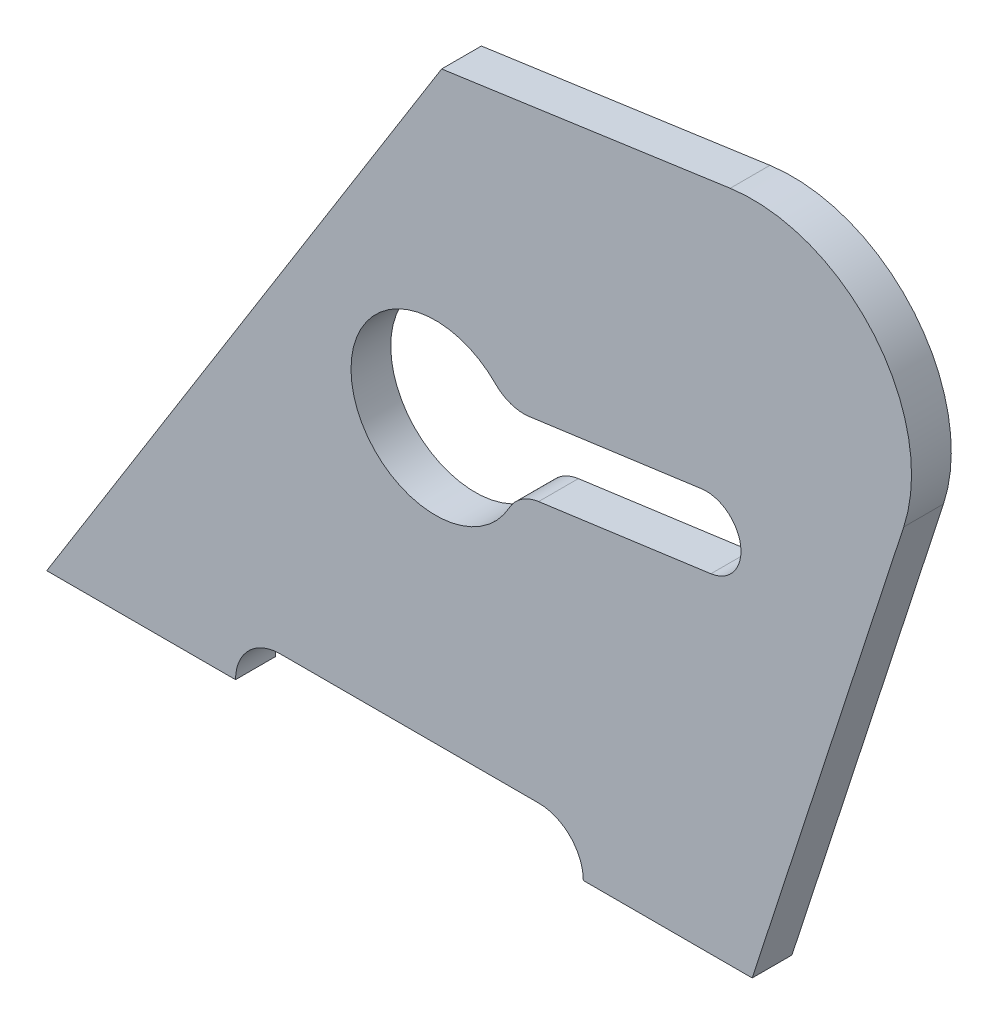
ISO-10303-21;
HEADER;
FILE_DESCRIPTION(('STEP AP214'),'2;1');
FILE_NAME('part.step','',(''),(''),'','','');
FILE_SCHEMA(('AUTOMOTIVE_DESIGN { 1 0 10303 214 1 1 1 1 }'));
ENDSEC;
DATA;
#1=APPLICATION_CONTEXT('core data for automotive mechanical design processes');
#2=APPLICATION_PROTOCOL_DEFINITION('international standard','automotive_design',2000,#1);
#3=PRODUCT_CONTEXT('',#1,'mechanical');
#4=PRODUCT('Part','Part','',(#3));
#5=PRODUCT_RELATED_PRODUCT_CATEGORY('part','',(#4));
#6=PRODUCT_DEFINITION_FORMATION('','',#4);
#7=PRODUCT_DEFINITION_CONTEXT('part definition',#1,'design');
#8=PRODUCT_DEFINITION('design','',#6,#7);
#9=PRODUCT_DEFINITION_SHAPE('','',#8);
#10=(LENGTH_UNIT() NAMED_UNIT(*) SI_UNIT(.MILLI.,.METRE.));
#11=(NAMED_UNIT(*) PLANE_ANGLE_UNIT() SI_UNIT($,.RADIAN.));
#12=(NAMED_UNIT(*) SI_UNIT($,.STERADIAN.) SOLID_ANGLE_UNIT());
#13=UNCERTAINTY_MEASURE_WITH_UNIT(LENGTH_MEASURE(1.E-05),#10,'distance_accuracy_value','');
#14=(GEOMETRIC_REPRESENTATION_CONTEXT(3) GLOBAL_UNCERTAINTY_ASSIGNED_CONTEXT((#13)) GLOBAL_UNIT_ASSIGNED_CONTEXT((#10,
#11,#12)) REPRESENTATION_CONTEXT('',''));
#15=CARTESIAN_POINT('',(0.,0.,0.));
#16=DIRECTION('',(0.,0.,1.));
#17=DIRECTION('',(1.,0.,0.));
#18=AXIS2_PLACEMENT_3D('',#15,#16,#17);
#19=CARTESIAN_POINT('',(128.440206600622,-41.7327529127653,8.));
#20=DIRECTION('',(-0.951056516295154,0.309016994374945,0.));
#21=DIRECTION('',(-0.309016994374945,-0.951056516295155,0.));
#22=AXIS2_PLACEMENT_3D('',#19,#20,#21);
#23=PLANE('',#22);
#24=DIRECTION('',(0.309016994374945,0.951056516295155,0.));
#25=VECTOR('',#24,1.);
#26=CARTESIAN_POINT('',(128.440206600622,-41.7327529127653,0.));
#27=LINE('',#26,#25);
#28=CARTESIAN_POINT('',(142.,0.,0.));
#29=VERTEX_POINT('',#28);
#30=CARTESIAN_POINT('',(172.503548140475,93.8802679373735,0.));
#31=VERTEX_POINT('',#30);
#32=EDGE_CURVE('E216',#29,#31,#27,.T.);
#33=ORIENTED_EDGE('',*,*,#32,.T.);
#34=DIRECTION('',(0.,0.,-1.));
#35=VECTOR('',#34,1.);
#36=CARTESIAN_POINT('',(172.503548140475,93.8802679373735,8.));
#37=LINE('',#36,#35);
#38=CARTESIAN_POINT('',(172.503548140475,93.8802679373735,8.));
#39=VERTEX_POINT('',#38);
#40=EDGE_CURVE('E11',#39,#31,#37,.T.);
#41=ORIENTED_EDGE('',*,*,#40,.F.);
#42=DIRECTION('',(0.309016994374945,0.951056516295155,0.));
#43=VECTOR('',#42,1.);
#44=CARTESIAN_POINT('',(128.440206600622,-41.7327529127653,8.));
#45=LINE('',#44,#43);
#46=CARTESIAN_POINT('',(142.,0.,8.));
#47=VERTEX_POINT('',#46);
#48=EDGE_CURVE('E317',#47,#39,#45,.T.);
#49=ORIENTED_EDGE('',*,*,#48,.F.);
#50=DIRECTION('',(0.,0.,-1.));
#51=VECTOR('',#50,1.);
#52=CARTESIAN_POINT('',(142.,0.,8.));
#53=LINE('',#52,#51);
#54=EDGE_CURVE('E242',#47,#29,#53,.T.);
#55=ORIENTED_EDGE('',*,*,#54,.T.);
#56=EDGE_LOOP('',(#33,#41,#49,#55));
#57=FACE_BOUND('',#56,.T.);
#58=ADVANCED_FACE('F45',(#57),#23,.F.);
#59=CARTESIAN_POINT('',(142.06973961903,103.768811757372,8.));
#60=DIRECTION('',(0.,0.,-1.));
#61=DIRECTION('',(-1.,0.,0.));
#62=AXIS2_PLACEMENT_3D('',#59,#60,#61);
#63=CYLINDRICAL_SURFACE('',#62,32.0000000000001);
#64=CARTESIAN_POINT('',(142.06973961903,103.768811757372,0.));
#65=DIRECTION('',(0.,0.,1.));
#66=DIRECTION('',(1.,0.,0.));
#67=AXIS2_PLACEMENT_3D('',#64,#65,#66);
#68=CIRCLE('',#67,32.0000000000001);
#69=CARTESIAN_POINT('',(137.573015723534,135.451290735629,0.));
#70=VERTEX_POINT('',#69);
#71=EDGE_CURVE('E220',#31,#70,#68,.T.);
#72=ORIENTED_EDGE('',*,*,#71,.T.);
#73=DIRECTION('',(0.,0.,-1.));
#74=VECTOR('',#73,1.);
#75=CARTESIAN_POINT('',(137.573015723534,135.451290735629,8.));
#76=LINE('',#75,#74);
#77=CARTESIAN_POINT('',(137.573015723534,135.451290735629,8.));
#78=VERTEX_POINT('',#77);
#79=EDGE_CURVE('E56',#78,#70,#76,.T.);
#80=ORIENTED_EDGE('',*,*,#79,.F.);
#81=CARTESIAN_POINT('',(142.06973961903,103.768811757372,8.));
#82=DIRECTION('',(0.,0.,1.));
#83=DIRECTION('',(1.,0.,0.));
#84=AXIS2_PLACEMENT_3D('',#81,#82,#83);
#85=CIRCLE('',#84,32.0000000000001);
#86=EDGE_CURVE('E320',#39,#78,#85,.T.);
#87=ORIENTED_EDGE('',*,*,#86,.F.);
#88=ORIENTED_EDGE('',*,*,#40,.T.);
#89=EDGE_LOOP('',(#72,#80,#87,#88));
#90=FACE_BOUND('',#89,.T.);
#91=ADVANCED_FACE('F362',(#90),#63,.T.);
#92=CARTESIAN_POINT('',(-16.1285050060782,113.636290037189,8.));
#93=DIRECTION('',(0.14052262173426,-0.990077468070519,0.));
#94=DIRECTION('',(0.990077468070519,0.14052262173426,0.));
#95=AXIS2_PLACEMENT_3D('',#92,#93,#94);
#96=PLANE('',#95);
#97=DIRECTION('',(-0.990077468070519,-0.14052262173426,0.));
#98=VECTOR('',#97,1.);
#99=CARTESIAN_POINT('',(-16.1285050060782,113.636290037189,0.));
#100=LINE('',#99,#98);
#101=CARTESIAN_POINT('',(79.4878896349813,127.207214423464,0.));
#102=VERTEX_POINT('',#101);
#103=EDGE_CURVE('E223',#70,#102,#100,.T.);
#104=ORIENTED_EDGE('',*,*,#103,.T.);
#105=DIRECTION('',(0.,0.,-1.));
#106=VECTOR('',#105,1.);
#107=CARTESIAN_POINT('',(79.4878896349813,127.207214423464,8.));
#108=LINE('',#107,#106);
#109=CARTESIAN_POINT('',(79.4878896349813,127.207214423464,8.));
#110=VERTEX_POINT('',#109);
#111=EDGE_CURVE('E257',#110,#102,#108,.T.);
#112=ORIENTED_EDGE('',*,*,#111,.F.);
#113=DIRECTION('',(-0.990077468070519,-0.14052262173426,0.));
#114=VECTOR('',#113,1.);
#115=CARTESIAN_POINT('',(-16.1285050060782,113.636290037189,8.));
#116=LINE('',#115,#114);
#117=EDGE_CURVE('E323',#78,#110,#116,.T.);
#118=ORIENTED_EDGE('',*,*,#117,.F.);
#119=ORIENTED_EDGE('',*,*,#79,.T.);
#120=EDGE_LOOP('',(#104,#112,#118,#119));
#121=FACE_BOUND('',#120,.T.);
#122=ADVANCED_FACE('F367',(#121),#96,.F.);
#123=CARTESIAN_POINT('',(0.,0.,8.));
#124=DIRECTION('',(0.848048096156423,-0.529919264233209,0.));
#125=DIRECTION('',(0.529919264233209,0.848048096156423,0.));
#126=AXIS2_PLACEMENT_3D('',#123,#124,#125);
#127=PLANE('',#126);
#128=DIRECTION('',(-0.529919264233209,-0.848048096156423,0.));
#129=VECTOR('',#128,1.);
#130=CARTESIAN_POINT('',(0.,0.,0.));
#131=LINE('',#130,#129);
#132=CARTESIAN_POINT('',(0.,0.,0.));
#133=VERTEX_POINT('',#132);
#134=EDGE_CURVE('E226',#102,#133,#131,.T.);
#135=ORIENTED_EDGE('',*,*,#134,.T.);
#136=DIRECTION('',(0.,0.,-1.));
#137=VECTOR('',#136,1.);
#138=CARTESIAN_POINT('',(0.,0.,8.));
#139=LINE('',#138,#137);
#140=CARTESIAN_POINT('',(0.,0.,8.));
#141=VERTEX_POINT('',#140);
#142=EDGE_CURVE('E253',#141,#133,#139,.T.);
#143=ORIENTED_EDGE('',*,*,#142,.F.);
#144=DIRECTION('',(-0.529919264233209,-0.848048096156423,0.));
#145=VECTOR('',#144,1.);
#146=CARTESIAN_POINT('',(0.,0.,8.));
#147=LINE('',#146,#145);
#148=EDGE_CURVE('E326',#110,#141,#147,.T.);
#149=ORIENTED_EDGE('',*,*,#148,.F.);
#150=ORIENTED_EDGE('',*,*,#111,.T.);
#151=EDGE_LOOP('',(#135,#143,#149,#150));
#152=FACE_BOUND('',#151,.T.);
#153=ADVANCED_FACE('F394',(#152),#127,.F.);
#154=CARTESIAN_POINT('',(0.,0.,8.));
#155=DIRECTION('',(0.,1.,0.));
#156=DIRECTION('',(0.,0.,1.));
#157=AXIS2_PLACEMENT_3D('',#154,#155,#156);
#158=PLANE('',#157);
#159=DIRECTION('',(1.,0.,0.));
#160=VECTOR('',#159,1.);
#161=CARTESIAN_POINT('',(0.,0.,0.));
#162=LINE('',#161,#160);
#163=CARTESIAN_POINT('',(38.,0.,0.));
#164=VERTEX_POINT('',#163);
#165=EDGE_CURVE('E229',#133,#164,#162,.T.);
#166=ORIENTED_EDGE('',*,*,#165,.T.);
#167=DIRECTION('',(0.,0.,-1.));
#168=VECTOR('',#167,1.);
#169=CARTESIAN_POINT('',(38.,0.,8.));
#170=LINE('',#169,#168);
#171=CARTESIAN_POINT('',(38.,0.,8.));
#172=VERTEX_POINT('',#171);
#173=EDGE_CURVE('E249',#172,#164,#170,.T.);
#174=ORIENTED_EDGE('',*,*,#173,.F.);
#175=DIRECTION('',(1.,0.,0.));
#176=VECTOR('',#175,1.);
#177=CARTESIAN_POINT('',(0.,0.,8.));
#178=LINE('',#177,#176);
#179=EDGE_CURVE('E329',#141,#172,#178,.T.);
#180=ORIENTED_EDGE('',*,*,#179,.F.);
#181=ORIENTED_EDGE('',*,*,#142,.T.);
#182=EDGE_LOOP('',(#166,#174,#180,#181));
#183=FACE_BOUND('',#182,.T.);
#184=ADVANCED_FACE('F337',(#183),#158,.F.);
#185=CARTESIAN_POINT('',(47.,0.,8.));
#186=DIRECTION('',(0.,0.,-1.));
#187=DIRECTION('',(-1.,0.,0.));
#188=AXIS2_PLACEMENT_3D('',#185,#186,#187);
#189=CYLINDRICAL_SURFACE('',#188,9.);
#190=CARTESIAN_POINT('',(47.,0.,0.));
#191=DIRECTION('',(0.,0.,1.));
#192=DIRECTION('',(1.,0.,0.));
#193=AXIS2_PLACEMENT_3D('',#190,#191,#192);
#194=CIRCLE('',#193,9.);
#195=CARTESIAN_POINT('',(47.,9.,0.));
#196=VERTEX_POINT('',#195);
#197=EDGE_CURVE('E232',#164,#196,#194,.F.);
#198=ORIENTED_EDGE('',*,*,#197,.T.);
#199=DIRECTION('',(0.,0.,-1.));
#200=VECTOR('',#199,1.);
#201=CARTESIAN_POINT('',(47.,9.,8.));
#202=LINE('',#201,#200);
#203=CARTESIAN_POINT('',(47.,9.,8.));
#204=VERTEX_POINT('',#203);
#205=EDGE_CURVE('E181',#204,#196,#202,.T.);
#206=ORIENTED_EDGE('',*,*,#205,.F.);
#207=CARTESIAN_POINT('',(47.,0.,8.));
#208=DIRECTION('',(0.,0.,1.));
#209=DIRECTION('',(1.,0.,0.));
#210=AXIS2_PLACEMENT_3D('',#207,#208,#209);
#211=CIRCLE('',#210,9.);
#212=EDGE_CURVE('E170',#172,#204,#211,.F.);
#213=ORIENTED_EDGE('',*,*,#212,.F.);
#214=ORIENTED_EDGE('',*,*,#173,.T.);
#215=EDGE_LOOP('',(#198,#206,#213,#214));
#216=FACE_BOUND('',#215,.T.);
#217=ADVANCED_FACE('F341',(#216),#189,.F.);
#218=CARTESIAN_POINT('',(0.,9.,8.));
#219=DIRECTION('',(0.,1.,0.));
#220=DIRECTION('',(-1.,0.,0.));
#221=AXIS2_PLACEMENT_3D('',#218,#219,#220);
#222=PLANE('',#221);
#223=DIRECTION('',(1.,0.,0.));
#224=VECTOR('',#223,1.);
#225=CARTESIAN_POINT('',(0.,9.,0.));
#226=LINE('',#225,#224);
#227=CARTESIAN_POINT('',(99.,9.,0.));
#228=VERTEX_POINT('',#227);
#229=EDGE_CURVE('E179',#196,#228,#226,.T.);
#230=ORIENTED_EDGE('',*,*,#229,.T.);
#231=DIRECTION('',(0.,0.,-1.));
#232=VECTOR('',#231,1.);
#233=CARTESIAN_POINT('',(99.,9.,8.));
#234=LINE('',#233,#232);
#235=CARTESIAN_POINT('',(99.,9.,8.));
#236=VERTEX_POINT('',#235);
#237=EDGE_CURVE('E176',#236,#228,#234,.T.);
#238=ORIENTED_EDGE('',*,*,#237,.F.);
#239=DIRECTION('',(1.,0.,0.));
#240=VECTOR('',#239,1.);
#241=CARTESIAN_POINT('',(0.,9.,8.));
#242=LINE('',#241,#240);
#243=EDGE_CURVE('E164',#204,#236,#242,.T.);
#244=ORIENTED_EDGE('',*,*,#243,.F.);
#245=ORIENTED_EDGE('',*,*,#205,.T.);
#246=EDGE_LOOP('',(#230,#238,#244,#245));
#247=FACE_BOUND('',#246,.T.);
#248=ADVANCED_FACE('F177',(#247),#222,.F.);
#249=CARTESIAN_POINT('',(99.,0.,8.));
#250=DIRECTION('',(0.,0.,-1.));
#251=DIRECTION('',(-1.,0.,0.));
#252=AXIS2_PLACEMENT_3D('',#249,#250,#251);
#253=CYLINDRICAL_SURFACE('',#252,9.);
#254=CARTESIAN_POINT('',(99.,0.,0.));
#255=DIRECTION('',(0.,0.,1.));
#256=DIRECTION('',(1.,0.,0.));
#257=AXIS2_PLACEMENT_3D('',#254,#255,#256);
#258=CIRCLE('',#257,9.);
#259=CARTESIAN_POINT('',(108.,0.,0.));
#260=VERTEX_POINT('',#259);
#261=EDGE_CURVE('E115',#228,#260,#258,.F.);
#262=ORIENTED_EDGE('',*,*,#261,.T.);
#263=DIRECTION('',(0.,0.,-1.));
#264=VECTOR('',#263,1.);
#265=CARTESIAN_POINT('',(108.,0.,8.));
#266=LINE('',#265,#264);
#267=CARTESIAN_POINT('',(108.,0.,8.));
#268=VERTEX_POINT('',#267);
#269=EDGE_CURVE('E182',#268,#260,#266,.T.);
#270=ORIENTED_EDGE('',*,*,#269,.F.);
#271=CARTESIAN_POINT('',(99.,0.,8.));
#272=DIRECTION('',(0.,0.,1.));
#273=DIRECTION('',(1.,0.,0.));
#274=AXIS2_PLACEMENT_3D('',#271,#272,#273);
#275=CIRCLE('',#274,9.);
#276=EDGE_CURVE('E168',#236,#268,#275,.F.);
#277=ORIENTED_EDGE('',*,*,#276,.F.);
#278=ORIENTED_EDGE('',*,*,#237,.T.);
#279=EDGE_LOOP('',(#262,#270,#277,#278));
#280=FACE_BOUND('',#279,.T.);
#281=ADVANCED_FACE('F184',(#280),#253,.F.);
#282=CARTESIAN_POINT('',(96.0230216383311,83.3541360483293,8.));
#283=DIRECTION('',(0.,0.,-1.));
#284=DIRECTION('',(-1.,0.,0.));
#285=AXIS2_PLACEMENT_3D('',#282,#283,#284);
#286=CYLINDRICAL_SURFACE('',#285,8.00000000000002);
#287=CARTESIAN_POINT('',(96.0230216383311,83.3541360483293,0.));
#288=DIRECTION('',(0.,0.,1.));
#289=DIRECTION('',(1.,0.,0.));
#290=AXIS2_PLACEMENT_3D('',#287,#288,#289);
#291=CIRCLE('',#290,8.00000000000002);
#292=CARTESIAN_POINT('',(97.1091335214087,75.4282063881924,0.));
#293=VERTEX_POINT('',#292);
#294=CARTESIAN_POINT('',(90.3339450400682,77.7296887457851,0.));
#295=VERTEX_POINT('',#294);
#296=EDGE_CURVE('E192',#293,#295,#291,.F.);
#297=ORIENTED_EDGE('',*,*,#296,.F.);
#298=DIRECTION('',(0.,0.,-1.));
#299=VECTOR('',#298,1.);
#300=CARTESIAN_POINT('',(97.1091335214087,75.4282063881924,8.));
#301=LINE('',#300,#299);
#302=CARTESIAN_POINT('',(97.1091335214087,75.4282063881924,8.));
#303=VERTEX_POINT('',#302);
#304=EDGE_CURVE('E49',#303,#293,#301,.T.);
#305=ORIENTED_EDGE('',*,*,#304,.F.);
#306=CARTESIAN_POINT('',(96.0230216383311,83.3541360483293,8.));
#307=DIRECTION('',(0.,0.,1.));
#308=DIRECTION('',(1.,0.,0.));
#309=AXIS2_PLACEMENT_3D('',#306,#307,#308);
#310=CIRCLE('',#309,8.00000000000002);
#311=CARTESIAN_POINT('',(90.3339450400682,77.7296887457851,8.));
#312=VERTEX_POINT('',#311);
#313=EDGE_CURVE('E241',#303,#312,#310,.F.);
#314=ORIENTED_EDGE('',*,*,#313,.T.);
#315=DIRECTION('',(0.,0.,-1.));
#316=VECTOR('',#315,1.);
#317=CARTESIAN_POINT('',(90.3339450400682,77.7296887457851,8.));
#318=LINE('',#317,#316);
#319=EDGE_CURVE('E188',#312,#295,#318,.T.);
#320=ORIENTED_EDGE('',*,*,#319,.T.);
#321=EDGE_LOOP('',(#297,#305,#314,#320));
#322=FACE_BOUND('',#321,.T.);
#323=ADVANCED_FACE('F47',(#322),#286,.T.);
#324=CARTESIAN_POINT('',(-8.35571792984683,60.9760684914448,8.));
#325=DIRECTION('',(0.135763985384697,-0.990741207517111,0.));
#326=DIRECTION('',(0.990741207517111,0.135763985384698,0.));
#327=AXIS2_PLACEMENT_3D('',#324,#325,#326);
#328=PLANE('',#327);
#329=DIRECTION('',(-0.990741207517111,-0.135763985384697,0.));
#330=VECTOR('',#329,1.);
#331=CARTESIAN_POINT('',(-8.35571792984683,60.9760684914448,0.));
#332=LINE('',#331,#330);
#333=CARTESIAN_POINT('',(131.785075784508,80.1799458766568,0.));
#334=VERTEX_POINT('',#333);
#335=EDGE_CURVE('E196',#334,#293,#332,.T.);
#336=ORIENTED_EDGE('',*,*,#335,.F.);
#337=DIRECTION('',(0.,0.,-1.));
#338=VECTOR('',#337,1.);
#339=CARTESIAN_POINT('',(131.785075784508,80.1799458766568,8.));
#340=LINE('',#339,#338);
#341=CARTESIAN_POINT('',(131.785075784508,80.1799458766568,8.));
#342=VERTEX_POINT('',#341);
#343=EDGE_CURVE('E274',#342,#334,#340,.T.);
#344=ORIENTED_EDGE('',*,*,#343,.F.);
#345=DIRECTION('',(-0.990741207517111,-0.135763985384697,0.));
#346=VECTOR('',#345,1.);
#347=CARTESIAN_POINT('',(-8.35571792984683,60.9760684914448,8.));
#348=LINE('',#347,#346);
#349=EDGE_CURVE('E285',#342,#303,#348,.T.);
#350=ORIENTED_EDGE('',*,*,#349,.T.);
#351=ORIENTED_EDGE('',*,*,#304,.T.);
#352=EDGE_LOOP('',(#336,#344,#350,#351));
#353=FACE_BOUND('',#352,.T.);
#354=ADVANCED_FACE('F283',(#353),#328,.T.);
#355=CARTESIAN_POINT('',(132.7354236822,73.244757424037,8.));
#356=DIRECTION('',(0.,0.,-1.));
#357=DIRECTION('',(-1.,0.,0.));
#358=AXIS2_PLACEMENT_3D('',#355,#356,#357);
#359=CYLINDRICAL_SURFACE('',#358,7.00000000000002);
#360=CARTESIAN_POINT('',(132.7354236822,73.244757424037,0.));
#361=DIRECTION('',(0.,0.,1.));
#362=DIRECTION('',(1.,0.,0.));
#363=AXIS2_PLACEMENT_3D('',#360,#361,#362);
#364=CIRCLE('',#363,7.00000000000002);
#365=CARTESIAN_POINT('',(133.685771579893,66.3095689714172,0.));
#366=VERTEX_POINT('',#365);
#367=EDGE_CURVE('E200',#366,#334,#364,.T.);
#368=ORIENTED_EDGE('',*,*,#367,.F.);
#369=DIRECTION('',(0.,0.,-1.));
#370=VECTOR('',#369,1.);
#371=CARTESIAN_POINT('',(133.685771579893,66.3095689714172,8.));
#372=LINE('',#371,#370);
#373=CARTESIAN_POINT('',(133.685771579893,66.3095689714172,8.));
#374=VERTEX_POINT('',#373);
#375=EDGE_CURVE('E272',#374,#366,#372,.T.);
#376=ORIENTED_EDGE('',*,*,#375,.F.);
#377=CARTESIAN_POINT('',(132.7354236822,73.244757424037,8.));
#378=DIRECTION('',(0.,0.,1.));
#379=DIRECTION('',(1.,0.,0.));
#380=AXIS2_PLACEMENT_3D('',#377,#378,#379);
#381=CIRCLE('',#380,7.00000000000002);
#382=EDGE_CURVE('E294',#374,#342,#381,.T.);
#383=ORIENTED_EDGE('',*,*,#382,.T.);
#384=ORIENTED_EDGE('',*,*,#343,.T.);
#385=EDGE_LOOP('',(#368,#376,#383,#384));
#386=FACE_BOUND('',#385,.T.);
#387=ADVANCED_FACE('F291',(#386),#359,.F.);
#388=CARTESIAN_POINT('',(-6.45502213446107,47.1056915862052,8.));
#389=DIRECTION('',(0.135763985384698,-0.990741207517111,0.));
#390=DIRECTION('',(0.990741207517111,0.135763985384698,0.));
#391=AXIS2_PLACEMENT_3D('',#388,#389,#390);
#392=PLANE('',#391);
#393=DIRECTION('',(-0.990741207517111,-0.135763985384698,0.));
#394=VECTOR('',#393,1.);
#395=CARTESIAN_POINT('',(-6.45502213446107,47.1056915862052,0.));
#396=LINE('',#395,#394);
#397=CARTESIAN_POINT('',(99.0098293167945,61.5578294829528,0.));
#398=VERTEX_POINT('',#397);
#399=EDGE_CURVE('E204',#366,#398,#396,.T.);
#400=ORIENTED_EDGE('',*,*,#399,.T.);
#401=DIRECTION('',(0.,0.,-1.));
#402=VECTOR('',#401,1.);
#403=CARTESIAN_POINT('',(99.0098293167945,61.5578294829528,8.));
#404=LINE('',#403,#402);
#405=CARTESIAN_POINT('',(99.0098293167945,61.5578294829528,8.));
#406=VERTEX_POINT('',#405);
#407=EDGE_CURVE('E269',#406,#398,#404,.T.);
#408=ORIENTED_EDGE('',*,*,#407,.F.);
#409=DIRECTION('',(-0.990741207517111,-0.135763985384698,0.));
#410=VECTOR('',#409,1.);
#411=CARTESIAN_POINT('',(-6.45502213446107,47.1056915862052,8.));
#412=LINE('',#411,#410);
#413=EDGE_CURVE('E297',#374,#406,#412,.T.);
#414=ORIENTED_EDGE('',*,*,#413,.F.);
#415=ORIENTED_EDGE('',*,*,#375,.T.);
#416=EDGE_LOOP('',(#400,#408,#414,#415));
#417=FACE_BOUND('',#416,.T.);
#418=ADVANCED_FACE('F298',(#417),#392,.F.);
#419=CARTESIAN_POINT('',(100.095941199872,53.6318998228159,8.));
#420=DIRECTION('',(0.,0.,-1.));
#421=DIRECTION('',(-1.,0.,0.));
#422=AXIS2_PLACEMENT_3D('',#419,#420,#421);
#423=CYLINDRICAL_SURFACE('',#422,8.);
#424=CARTESIAN_POINT('',(100.095941199872,53.6318998228159,0.));
#425=DIRECTION('',(0.,0.,1.));
#426=DIRECTION('',(1.,0.,0.));
#427=AXIS2_PLACEMENT_3D('',#424,#425,#426);
#428=CIRCLE('',#427,8.);
#429=CARTESIAN_POINT('',(93.103530341916,57.518568112436,0.));
#430=VERTEX_POINT('',#429);
#431=EDGE_CURVE('E208',#430,#398,#428,.F.);
#432=ORIENTED_EDGE('',*,*,#431,.F.);
#433=DIRECTION('',(0.,0.,-1.));
#434=VECTOR('',#433,1.);
#435=CARTESIAN_POINT('',(93.103530341916,57.518568112436,8.));
#436=LINE('',#435,#434);
#437=CARTESIAN_POINT('',(93.103530341916,57.518568112436,8.));
#438=VERTEX_POINT('',#437);
#439=EDGE_CURVE('E266',#438,#430,#436,.T.);
#440=ORIENTED_EDGE('',*,*,#439,.F.);
#441=CARTESIAN_POINT('',(100.095941199872,53.6318998228159,8.));
#442=DIRECTION('',(0.,0.,1.));
#443=DIRECTION('',(1.,0.,0.));
#444=AXIS2_PLACEMENT_3D('',#441,#442,#443);
#445=CIRCLE('',#444,8.);
#446=EDGE_CURVE('E303',#438,#406,#445,.F.);
#447=ORIENTED_EDGE('',*,*,#446,.T.);
#448=ORIENTED_EDGE('',*,*,#407,.T.);
#449=EDGE_LOOP('',(#432,#440,#447,#448));
#450=FACE_BOUND('',#449,.T.);
#451=ADVANCED_FACE('F356',(#450),#423,.T.);
#452=CARTESIAN_POINT('',(78.2446572687594,65.7777382278786,8.));
#453=DIRECTION('',(0.,0.,-1.));
#454=DIRECTION('',(-1.,0.,0.));
#455=AXIS2_PLACEMENT_3D('',#452,#453,#454);
#456=CYLINDRICAL_SURFACE('',#455,17.);
#457=CARTESIAN_POINT('',(78.2446572687594,65.7777382278786,0.));
#458=DIRECTION('',(0.,0.,1.));
#459=DIRECTION('',(1.,0.,0.));
#460=AXIS2_PLACEMENT_3D('',#457,#458,#459);
#461=CIRCLE('',#460,17.);
#462=EDGE_CURVE('E212',#295,#430,#461,.T.);
#463=ORIENTED_EDGE('',*,*,#462,.F.);
#464=ORIENTED_EDGE('',*,*,#319,.F.);
#465=CARTESIAN_POINT('',(78.2446572687594,65.7777382278786,8.));
#466=DIRECTION('',(0.,0.,1.));
#467=DIRECTION('',(1.,0.,0.));
#468=AXIS2_PLACEMENT_3D('',#465,#466,#467);
#469=CIRCLE('',#468,17.);
#470=EDGE_CURVE('E313',#312,#438,#469,.T.);
#471=ORIENTED_EDGE('',*,*,#470,.T.);
#472=ORIENTED_EDGE('',*,*,#439,.T.);
#473=EDGE_LOOP('',(#463,#464,#471,#472));
#474=FACE_BOUND('',#473,.T.);
#475=ADVANCED_FACE('F349',(#474),#456,.F.);
#476=CARTESIAN_POINT('',(0.,0.,8.));
#477=DIRECTION('',(0.,1.,0.));
#478=DIRECTION('',(0.,0.,1.));
#479=AXIS2_PLACEMENT_3D('',#476,#477,#478);
#480=PLANE('',#479);
#481=DIRECTION('',(1.,0.,0.));
#482=VECTOR('',#481,1.);
#483=CARTESIAN_POINT('',(0.,0.,0.));
#484=LINE('',#483,#482);
#485=EDGE_CURVE('E121',#260,#29,#484,.T.);
#486=ORIENTED_EDGE('',*,*,#485,.T.);
#487=ORIENTED_EDGE('',*,*,#54,.F.);
#488=DIRECTION('',(1.,0.,0.));
#489=VECTOR('',#488,1.);
#490=CARTESIAN_POINT('',(0.,0.,8.));
#491=LINE('',#490,#489);
#492=EDGE_CURVE('E65',#268,#47,#491,.T.);
#493=ORIENTED_EDGE('',*,*,#492,.F.);
#494=ORIENTED_EDGE('',*,*,#269,.T.);
#495=EDGE_LOOP('',(#486,#487,#493,#494));
#496=FACE_BOUND('',#495,.T.);
#497=ADVANCED_FACE('F347',(#496),#480,.F.);
#498=CARTESIAN_POINT('',(0.,0.,8.));
#499=DIRECTION('',(0.,0.,1.));
#500=DIRECTION('',(1.,0.,0.));
#501=AXIS2_PLACEMENT_3D('',#498,#499,#500);
#502=PLANE('',#501);
#503=ORIENTED_EDGE('',*,*,#313,.F.);
#504=ORIENTED_EDGE('',*,*,#349,.F.);
#505=ORIENTED_EDGE('',*,*,#382,.F.);
#506=ORIENTED_EDGE('',*,*,#413,.T.);
#507=ORIENTED_EDGE('',*,*,#446,.F.);
#508=ORIENTED_EDGE('',*,*,#470,.F.);
#509=EDGE_LOOP('',(#503,#504,#505,#506,#507,#508));
#510=FACE_BOUND('',#509,.T.);
#511=ORIENTED_EDGE('',*,*,#48,.T.);
#512=ORIENTED_EDGE('',*,*,#86,.T.);
#513=ORIENTED_EDGE('',*,*,#117,.T.);
#514=ORIENTED_EDGE('',*,*,#148,.T.);
#515=ORIENTED_EDGE('',*,*,#179,.T.);
#516=ORIENTED_EDGE('',*,*,#212,.T.);
#517=ORIENTED_EDGE('',*,*,#243,.T.);
#518=ORIENTED_EDGE('',*,*,#276,.T.);
#519=ORIENTED_EDGE('',*,*,#492,.T.);
#520=EDGE_LOOP('',(#511,#512,#513,#514,#515,#516,#517,#518,#519));
#521=FACE_BOUND('',#520,.T.);
#522=ADVANCED_FACE('F166',(#510,#521),#502,.T.);
#523=CARTESIAN_POINT('',(0.,0.,0.));
#524=DIRECTION('',(0.,0.,1.));
#525=DIRECTION('',(1.,0.,0.));
#526=AXIS2_PLACEMENT_3D('',#523,#524,#525);
#527=PLANE('',#526);
#528=ORIENTED_EDGE('',*,*,#296,.T.);
#529=ORIENTED_EDGE('',*,*,#462,.T.);
#530=ORIENTED_EDGE('',*,*,#431,.T.);
#531=ORIENTED_EDGE('',*,*,#399,.F.);
#532=ORIENTED_EDGE('',*,*,#367,.T.);
#533=ORIENTED_EDGE('',*,*,#335,.T.);
#534=EDGE_LOOP('',(#528,#529,#530,#531,#532,#533));
#535=FACE_BOUND('',#534,.T.);
#536=ORIENTED_EDGE('',*,*,#32,.F.);
#537=ORIENTED_EDGE('',*,*,#485,.F.);
#538=ORIENTED_EDGE('',*,*,#261,.F.);
#539=ORIENTED_EDGE('',*,*,#229,.F.);
#540=ORIENTED_EDGE('',*,*,#197,.F.);
#541=ORIENTED_EDGE('',*,*,#165,.F.);
#542=ORIENTED_EDGE('',*,*,#134,.F.);
#543=ORIENTED_EDGE('',*,*,#103,.F.);
#544=ORIENTED_EDGE('',*,*,#71,.F.);
#545=EDGE_LOOP('',(#536,#537,#538,#539,#540,#541,#542,#543,#544));
#546=FACE_BOUND('',#545,.T.);
#547=ADVANCED_FACE('F288',(#535,#546),#527,.F.);
#548=CLOSED_SHELL('',(#58,#91,#122,#153,#184,#217,#248,#281,#323,#354,#387,#418,#451,#475,#497,
#522,#547));
#549=MANIFOLD_SOLID_BREP('B2',#548);
#550=ADVANCED_BREP_SHAPE_REPRESENTATION('',(#18,#549),#14);
#551=SHAPE_DEFINITION_REPRESENTATION(#9,#550);
ENDSEC;
END-ISO-10303-21;
